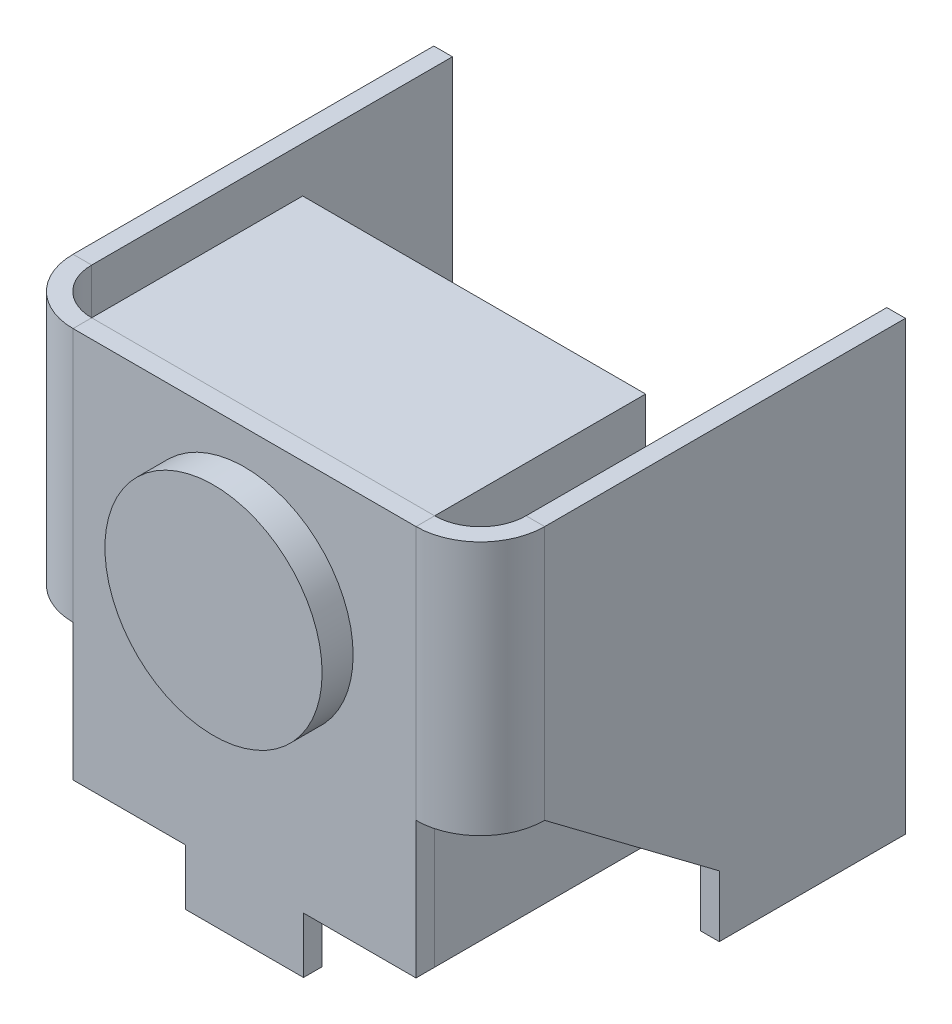
ISO-10303-21;
HEADER;
FILE_DESCRIPTION(('STEP AP214'),'2;1');
FILE_NAME('part.step','',(''),(''),'','','');
FILE_SCHEMA(('AUTOMOTIVE_DESIGN { 1 0 10303 214 1 1 1 1 }'));
ENDSEC;
DATA;
#1=APPLICATION_CONTEXT('core data for automotive mechanical design processes');
#2=APPLICATION_PROTOCOL_DEFINITION('international standard','automotive_design',2000,#1);
#3=PRODUCT_CONTEXT('',#1,'mechanical');
#4=PRODUCT('Part','Part','',(#3));
#5=PRODUCT_RELATED_PRODUCT_CATEGORY('part','',(#4));
#6=PRODUCT_DEFINITION_FORMATION('','',#4);
#7=PRODUCT_DEFINITION_CONTEXT('part definition',#1,'design');
#8=PRODUCT_DEFINITION('design','',#6,#7);
#9=PRODUCT_DEFINITION_SHAPE('','',#8);
#10=(LENGTH_UNIT() NAMED_UNIT(*) SI_UNIT(.MILLI.,.METRE.));
#11=(NAMED_UNIT(*) PLANE_ANGLE_UNIT() SI_UNIT($,.RADIAN.));
#12=(NAMED_UNIT(*) SI_UNIT($,.STERADIAN.) SOLID_ANGLE_UNIT());
#13=UNCERTAINTY_MEASURE_WITH_UNIT(LENGTH_MEASURE(1.E-05),#10,'distance_accuracy_value','');
#14=(GEOMETRIC_REPRESENTATION_CONTEXT(3) GLOBAL_UNCERTAINTY_ASSIGNED_CONTEXT((#13)) GLOBAL_UNIT_ASSIGNED_CONTEXT((#10,
#11,#12)) REPRESENTATION_CONTEXT('',''));
#15=CARTESIAN_POINT('',(0.,0.,0.));
#16=DIRECTION('',(0.,0.,1.));
#17=DIRECTION('',(1.,0.,0.));
#18=AXIS2_PLACEMENT_3D('',#15,#16,#17);
#19=CARTESIAN_POINT('',(2.7634,-2.7,-3.7));
#20=DIRECTION('',(-1.,0.,0.));
#21=DIRECTION('',(0.,0.,1.));
#22=AXIS2_PLACEMENT_3D('',#19,#20,#21);
#23=PLANE('',#22);
#24=DIRECTION('',(0.,-1.,0.));
#25=VECTOR('',#24,1.);
#26=CARTESIAN_POINT('',(2.7634,-2.7,-0.3));
#27=LINE('',#26,#25);
#28=CARTESIAN_POINT('',(2.7634,3.6,-0.3));
#29=VERTEX_POINT('',#28);
#30=CARTESIAN_POINT('',(2.7634,-2.7,-0.3));
#31=VERTEX_POINT('',#30);
#32=EDGE_CURVE('E129',#29,#31,#27,.T.);
#33=ORIENTED_EDGE('',*,*,#32,.T.);
#34=DIRECTION('',(0.,0.,1.));
#35=VECTOR('',#34,1.);
#36=CARTESIAN_POINT('',(2.7634,-2.7,-3.7));
#37=LINE('',#36,#35);
#38=CARTESIAN_POINT('',(2.7634,-2.7,-3.7));
#39=VERTEX_POINT('',#38);
#40=EDGE_CURVE('E14',#39,#31,#37,.T.);
#41=ORIENTED_EDGE('',*,*,#40,.F.);
#42=DIRECTION('',(0.,-1.,0.));
#43=VECTOR('',#42,1.);
#44=CARTESIAN_POINT('',(2.7634,-2.7,-3.7));
#45=LINE('',#44,#43);
#46=CARTESIAN_POINT('',(2.7634,3.6,-3.7));
#47=VERTEX_POINT('',#46);
#48=EDGE_CURVE('E117',#47,#39,#45,.T.);
#49=ORIENTED_EDGE('',*,*,#48,.F.);
#50=DIRECTION('',(0.,0.,1.));
#51=VECTOR('',#50,1.);
#52=CARTESIAN_POINT('',(2.7634,3.6,-3.7));
#53=LINE('',#52,#51);
#54=EDGE_CURVE('E125',#47,#29,#53,.T.);
#55=ORIENTED_EDGE('',*,*,#54,.T.);
#56=EDGE_LOOP('',(#33,#41,#49,#55));
#57=FACE_BOUND('',#56,.T.);
#58=ADVANCED_FACE('F66',(#57),#23,.F.);
#59=CARTESIAN_POINT('',(2.7634,-2.7,-3.7));
#60=DIRECTION('',(0.,1.,0.));
#61=DIRECTION('',(0.,0.,1.));
#62=AXIS2_PLACEMENT_3D('',#59,#60,#61);
#63=PLANE('',#62);
#64=DIRECTION('',(-1.,0.,0.));
#65=VECTOR('',#64,1.);
#66=CARTESIAN_POINT('',(2.7634,-2.7,-0.3));
#67=LINE('',#66,#65);
#68=CARTESIAN_POINT('',(-2.7634,-2.7,-0.3));
#69=VERTEX_POINT('',#68);
#70=EDGE_CURVE('E121',#31,#69,#67,.T.);
#71=ORIENTED_EDGE('',*,*,#70,.T.);
#72=DIRECTION('',(0.,0.,1.));
#73=VECTOR('',#72,1.);
#74=CARTESIAN_POINT('',(-2.7634,-2.7,-3.7));
#75=LINE('',#74,#73);
#76=CARTESIAN_POINT('',(-2.7634,-2.7,-3.7));
#77=VERTEX_POINT('',#76);
#78=EDGE_CURVE('E74',#77,#69,#75,.T.);
#79=ORIENTED_EDGE('',*,*,#78,.F.);
#80=DIRECTION('',(-1.,0.,0.));
#81=VECTOR('',#80,1.);
#82=CARTESIAN_POINT('',(2.7634,-2.7,-3.7));
#83=LINE('',#82,#81);
#84=EDGE_CURVE('E112',#39,#77,#83,.T.);
#85=ORIENTED_EDGE('',*,*,#84,.F.);
#86=ORIENTED_EDGE('',*,*,#40,.T.);
#87=EDGE_LOOP('',(#71,#79,#85,#86));
#88=FACE_BOUND('',#87,.T.);
#89=ADVANCED_FACE('F120',(#88),#63,.F.);
#90=CARTESIAN_POINT('',(-2.7634,-2.7,-3.7));
#91=DIRECTION('',(1.,0.,0.));
#92=DIRECTION('',(0.,0.,-1.));
#93=AXIS2_PLACEMENT_3D('',#90,#91,#92);
#94=PLANE('',#93);
#95=DIRECTION('',(0.,1.,0.));
#96=VECTOR('',#95,1.);
#97=CARTESIAN_POINT('',(-2.7634,-2.7,-0.3));
#98=LINE('',#97,#96);
#99=CARTESIAN_POINT('',(-2.7634,3.6,-0.3));
#100=VERTEX_POINT('',#99);
#101=EDGE_CURVE('E99',#69,#100,#98,.T.);
#102=ORIENTED_EDGE('',*,*,#101,.T.);
#103=DIRECTION('',(0.,0.,1.));
#104=VECTOR('',#103,1.);
#105=CARTESIAN_POINT('',(-2.7634,3.6,-3.7));
#106=LINE('',#105,#104);
#107=CARTESIAN_POINT('',(-2.7634,3.6,-3.7));
#108=VERTEX_POINT('',#107);
#109=EDGE_CURVE('E122',#108,#100,#106,.T.);
#110=ORIENTED_EDGE('',*,*,#109,.F.);
#111=DIRECTION('',(0.,1.,0.));
#112=VECTOR('',#111,1.);
#113=CARTESIAN_POINT('',(-2.7634,-2.7,-3.7));
#114=LINE('',#113,#112);
#115=EDGE_CURVE('E115',#77,#108,#114,.T.);
#116=ORIENTED_EDGE('',*,*,#115,.F.);
#117=ORIENTED_EDGE('',*,*,#78,.T.);
#118=EDGE_LOOP('',(#102,#110,#116,#117));
#119=FACE_BOUND('',#118,.T.);
#120=ADVANCED_FACE('F123',(#119),#94,.F.);
#121=CARTESIAN_POINT('',(2.7634,3.6,-3.7));
#122=DIRECTION('',(0.,-1.,0.));
#123=DIRECTION('',(0.,0.,-1.));
#124=AXIS2_PLACEMENT_3D('',#121,#122,#123);
#125=PLANE('',#124);
#126=DIRECTION('',(1.,0.,0.));
#127=VECTOR('',#126,1.);
#128=CARTESIAN_POINT('',(2.7634,3.6,-0.3));
#129=LINE('',#128,#127);
#130=EDGE_CURVE('E105',#100,#29,#129,.T.);
#131=ORIENTED_EDGE('',*,*,#130,.T.);
#132=ORIENTED_EDGE('',*,*,#54,.F.);
#133=DIRECTION('',(1.,0.,0.));
#134=VECTOR('',#133,1.);
#135=CARTESIAN_POINT('',(2.7634,3.6,-3.7));
#136=LINE('',#135,#134);
#137=EDGE_CURVE('E82',#108,#47,#136,.T.);
#138=ORIENTED_EDGE('',*,*,#137,.F.);
#139=ORIENTED_EDGE('',*,*,#109,.T.);
#140=EDGE_LOOP('',(#131,#132,#138,#139));
#141=FACE_BOUND('',#140,.T.);
#142=ADVANCED_FACE('F137',(#141),#125,.F.);
#143=CARTESIAN_POINT('',(0.,0.,-3.7));
#144=DIRECTION('',(0.,0.,1.));
#145=DIRECTION('',(1.,0.,0.));
#146=AXIS2_PLACEMENT_3D('',#143,#144,#145);
#147=PLANE('',#146);
#148=ORIENTED_EDGE('',*,*,#48,.T.);
#149=ORIENTED_EDGE('',*,*,#84,.T.);
#150=ORIENTED_EDGE('',*,*,#115,.T.);
#151=ORIENTED_EDGE('',*,*,#137,.T.);
#152=EDGE_LOOP('',(#148,#149,#150,#151));
#153=FACE_BOUND('',#152,.T.);
#154=ADVANCED_FACE('F113',(#153),#147,.F.);
#155=CARTESIAN_POINT('',(0.,0.,-0.3));
#156=DIRECTION('',(0.,0.,1.));
#157=DIRECTION('',(1.,0.,0.));
#158=AXIS2_PLACEMENT_3D('',#155,#156,#157);
#159=PLANE('',#158);
#160=CARTESIAN_POINT('',(-2.8421709430404E-11,1.3,-0.3));
#161=DIRECTION('',(0.,0.,1.));
#162=DIRECTION('',(1.,0.,0.));
#163=AXIS2_PLACEMENT_3D('',#160,#161,#162);
#164=CIRCLE('',#163,1.75);
#165=CARTESIAN_POINT('',(1.74999999997158,1.3,-0.3));
#166=VERTEX_POINT('',#165);
#167=EDGE_CURVE('E143',#166,#166,#164,.T.);
#168=ORIENTED_EDGE('',*,*,#167,.F.);
#169=EDGE_LOOP('',(#168));
#170=FACE_BOUND('',#169,.T.);
#171=ORIENTED_EDGE('',*,*,#32,.F.);
#172=ORIENTED_EDGE('',*,*,#130,.F.);
#173=ORIENTED_EDGE('',*,*,#101,.F.);
#174=ORIENTED_EDGE('',*,*,#70,.F.);
#175=EDGE_LOOP('',(#171,#172,#173,#174));
#176=FACE_BOUND('',#175,.T.);
#177=ADVANCED_FACE('F140',(#170,#176),#159,.T.);
#178=CARTESIAN_POINT('',(-2.8421709430404E-11,1.3,0.5));
#179=DIRECTION('',(0.,0.,-1.));
#180=DIRECTION('',(-1.,0.,0.));
#181=AXIS2_PLACEMENT_3D('',#178,#179,#180);
#182=CYLINDRICAL_SURFACE('',#181,1.75);
#183=CARTESIAN_POINT('',(-2.8421709430404E-11,1.3,0.5));
#184=DIRECTION('',(0.,0.,1.));
#185=DIRECTION('',(1.,0.,0.));
#186=AXIS2_PLACEMENT_3D('',#183,#184,#185);
#187=CIRCLE('',#186,1.75);
#188=CARTESIAN_POINT('',(1.74999999997158,1.3,0.5));
#189=VERTEX_POINT('',#188);
#190=EDGE_CURVE('E132',#189,#189,#187,.T.);
#191=ORIENTED_EDGE('',*,*,#190,.F.);
#192=EDGE_LOOP('',(#191));
#193=FACE_BOUND('',#192,.T.);
#194=ORIENTED_EDGE('',*,*,#167,.T.);
#195=EDGE_LOOP('',(#194));
#196=FACE_BOUND('',#195,.T.);
#197=ADVANCED_FACE('F151',(#193,#196),#182,.T.);
#198=CARTESIAN_POINT('',(-2.8421709430404E-11,1.3,0.5));
#199=DIRECTION('',(0.,0.,1.));
#200=DIRECTION('',(1.,0.,0.));
#201=AXIS2_PLACEMENT_3D('',#198,#199,#200);
#202=PLANE('',#201);
#203=ORIENTED_EDGE('',*,*,#190,.T.);
#204=EDGE_LOOP('',(#203));
#205=FACE_BOUND('',#204,.T.);
#206=ADVANCED_FACE('F149',(#205),#202,.T.);
#207=CLOSED_SHELL('',(#58,#89,#120,#142,#154,#177,#197,#206));
#208=MANIFOLD_SOLID_BREP('B2',#207);
#209=CARTESIAN_POINT('',(0.,3.6,-0.3));
#210=DIRECTION('',(0.,1.,0.));
#211=DIRECTION('',(-1.,0.,0.));
#212=AXIS2_PLACEMENT_3D('',#209,#210,#211);
#213=PLANE('',#212);
#214=DIRECTION('',(-1.,0.,0.));
#215=VECTOR('',#214,1.);
#216=CARTESIAN_POINT('',(0.,3.6,-0.3));
#217=LINE('',#216,#215);
#218=CARTESIAN_POINT('',(2.7634,3.6,-0.3));
#219=VERTEX_POINT('',#218);
#220=CARTESIAN_POINT('',(-2.7634,3.6,-0.3));
#221=VERTEX_POINT('',#220);
#222=EDGE_CURVE('E563',#219,#221,#217,.T.);
#223=ORIENTED_EDGE('',*,*,#222,.T.);
#224=DIRECTION('',(0.,0.,1.));
#225=VECTOR('',#224,1.);
#226=CARTESIAN_POINT('',(-2.7634,3.6,-0.3));
#227=LINE('',#226,#225);
#228=CARTESIAN_POINT('',(-2.7634,3.6,0.));
#229=VERTEX_POINT('',#228);
#230=EDGE_CURVE('E550',#221,#229,#227,.T.);
#231=ORIENTED_EDGE('',*,*,#230,.T.);
#232=DIRECTION('',(-1.,0.,0.));
#233=VECTOR('',#232,1.);
#234=CARTESIAN_POINT('',(0.,3.6,0.));
#235=LINE('',#234,#233);
#236=CARTESIAN_POINT('',(2.7634,3.6,0.));
#237=VERTEX_POINT('',#236);
#238=EDGE_CURVE('E564',#237,#229,#235,.T.);
#239=ORIENTED_EDGE('',*,*,#238,.F.);
#240=DIRECTION('',(0.,0.,1.));
#241=VECTOR('',#240,1.);
#242=CARTESIAN_POINT('',(2.7634,3.6,-0.3));
#243=LINE('',#242,#241);
#244=EDGE_CURVE('E397',#219,#237,#243,.T.);
#245=ORIENTED_EDGE('',*,*,#244,.F.);
#246=EDGE_LOOP('',(#223,#231,#239,#245));
#247=FACE_BOUND('',#246,.T.);
#248=ADVANCED_FACE('F219',(#247),#213,.T.);
#249=CARTESIAN_POINT('',(0.,0.,-0.3));
#250=DIRECTION('',(0.,0.,1.));
#251=DIRECTION('',(1.,0.,0.));
#252=AXIS2_PLACEMENT_3D('',#249,#250,#251);
#253=PLANE('',#252);
#254=DIRECTION('',(0.,1.,0.));
#255=VECTOR('',#254,1.);
#256=CARTESIAN_POINT('',(-0.949999999999999,-3.6,-0.3));
#257=LINE('',#256,#255);
#258=CARTESIAN_POINT('',(-0.949999999999999,-3.6,-0.3));
#259=VERTEX_POINT('',#258);
#260=CARTESIAN_POINT('',(-0.949999999999999,-2.7,-0.3));
#261=VERTEX_POINT('',#260);
#262=EDGE_CURVE('E502',#259,#261,#257,.T.);
#263=ORIENTED_EDGE('',*,*,#262,.T.);
#264=DIRECTION('',(-1.,0.,0.));
#265=VECTOR('',#264,1.);
#266=CARTESIAN_POINT('',(-2.7634,-2.7,-0.3));
#267=LINE('',#266,#265);
#268=CARTESIAN_POINT('',(-2.7634,-2.7,-0.3));
#269=VERTEX_POINT('',#268);
#270=EDGE_CURVE('E505',#261,#269,#267,.T.);
#271=ORIENTED_EDGE('',*,*,#270,.T.);
#272=DIRECTION('',(0.,1.,0.));
#273=VECTOR('',#272,1.);
#274=CARTESIAN_POINT('',(-2.7634,3.6,-0.3));
#275=LINE('',#274,#273);
#276=CARTESIAN_POINT('',(-2.7634,-0.5,-0.300000000000001));
#277=VERTEX_POINT('',#276);
#278=EDGE_CURVE('E491',#269,#277,#275,.T.);
#279=ORIENTED_EDGE('',*,*,#278,.T.);
#280=DIRECTION('',(0.,1.,0.));
#281=VECTOR('',#280,1.);
#282=CARTESIAN_POINT('',(-2.7634,3.6,-0.3));
#283=LINE('',#282,#281);
#284=EDGE_CURVE('E553',#221,#277,#283,.F.);
#285=ORIENTED_EDGE('',*,*,#284,.F.);
#286=ORIENTED_EDGE('',*,*,#222,.F.);
#287=DIRECTION('',(0.,1.,0.));
#288=VECTOR('',#287,1.);
#289=CARTESIAN_POINT('',(2.7634,3.6,-0.3));
#290=LINE('',#289,#288);
#291=CARTESIAN_POINT('',(2.7634,-0.5,-0.300000000000001));
#292=VERTEX_POINT('',#291);
#293=EDGE_CURVE('E465',#219,#292,#290,.F.);
#294=ORIENTED_EDGE('',*,*,#293,.T.);
#295=DIRECTION('',(0.,1.,0.));
#296=VECTOR('',#295,1.);
#297=CARTESIAN_POINT('',(2.7634,3.6,-0.3));
#298=LINE('',#297,#296);
#299=CARTESIAN_POINT('',(2.7634,-2.7,-0.3));
#300=VERTEX_POINT('',#299);
#301=EDGE_CURVE('E371',#300,#292,#298,.T.);
#302=ORIENTED_EDGE('',*,*,#301,.F.);
#303=DIRECTION('',(1.,0.,0.));
#304=VECTOR('',#303,1.);
#305=CARTESIAN_POINT('',(2.7634,-2.7,-0.3));
#306=LINE('',#305,#304);
#307=CARTESIAN_POINT('',(0.95,-2.7,-0.3));
#308=VERTEX_POINT('',#307);
#309=EDGE_CURVE('E420',#308,#300,#306,.T.);
#310=ORIENTED_EDGE('',*,*,#309,.F.);
#311=DIRECTION('',(0.,1.,0.));
#312=VECTOR('',#311,1.);
#313=CARTESIAN_POINT('',(0.95,-3.6,-0.3));
#314=LINE('',#313,#312);
#315=CARTESIAN_POINT('',(0.95,-3.6,-0.3));
#316=VERTEX_POINT('',#315);
#317=EDGE_CURVE('E417',#316,#308,#314,.T.);
#318=ORIENTED_EDGE('',*,*,#317,.F.);
#319=DIRECTION('',(1.,0.,0.));
#320=VECTOR('',#319,1.);
#321=CARTESIAN_POINT('',(0.,-3.6,-0.3));
#322=LINE('',#321,#320);
#323=EDGE_CURVE('E561',#259,#316,#322,.T.);
#324=ORIENTED_EDGE('',*,*,#323,.F.);
#325=EDGE_LOOP('',(#263,#271,#279,#285,#286,#294,#302,#310,#318,#324));
#326=FACE_BOUND('',#325,.T.);
#327=ADVANCED_FACE('F633',(#326),#253,.F.);
#328=CARTESIAN_POINT('',(0.,0.,0.));
#329=DIRECTION('',(0.,0.,1.));
#330=DIRECTION('',(1.,0.,0.));
#331=AXIS2_PLACEMENT_3D('',#328,#329,#330);
#332=PLANE('',#331);
#333=DIRECTION('',(-1.,0.,0.));
#334=VECTOR('',#333,1.);
#335=CARTESIAN_POINT('',(-2.7634,-2.7,0.));
#336=LINE('',#335,#334);
#337=CARTESIAN_POINT('',(-0.949999999999999,-2.7,0.));
#338=VERTEX_POINT('',#337);
#339=CARTESIAN_POINT('',(-2.7634,-2.7,0.));
#340=VERTEX_POINT('',#339);
#341=EDGE_CURVE('E506',#338,#340,#336,.T.);
#342=ORIENTED_EDGE('',*,*,#341,.F.);
#343=DIRECTION('',(0.,1.,0.));
#344=VECTOR('',#343,1.);
#345=CARTESIAN_POINT('',(-0.949999999999999,-3.6,0.));
#346=LINE('',#345,#344);
#347=CARTESIAN_POINT('',(-0.949999999999999,-3.6,0.));
#348=VERTEX_POINT('',#347);
#349=EDGE_CURVE('E501',#348,#338,#346,.T.);
#350=ORIENTED_EDGE('',*,*,#349,.F.);
#351=DIRECTION('',(1.,0.,0.));
#352=VECTOR('',#351,1.);
#353=CARTESIAN_POINT('',(0.,-3.6,0.));
#354=LINE('',#353,#352);
#355=CARTESIAN_POINT('',(0.95,-3.6,0.));
#356=VERTEX_POINT('',#355);
#357=EDGE_CURVE('E560',#348,#356,#354,.T.);
#358=ORIENTED_EDGE('',*,*,#357,.T.);
#359=DIRECTION('',(0.,1.,0.));
#360=VECTOR('',#359,1.);
#361=CARTESIAN_POINT('',(0.95,-3.6,0.));
#362=LINE('',#361,#360);
#363=CARTESIAN_POINT('',(0.95,-2.7,0.));
#364=VERTEX_POINT('',#363);
#365=EDGE_CURVE('E386',#356,#364,#362,.T.);
#366=ORIENTED_EDGE('',*,*,#365,.T.);
#367=DIRECTION('',(1.,0.,0.));
#368=VECTOR('',#367,1.);
#369=CARTESIAN_POINT('',(2.7634,-2.7,0.));
#370=LINE('',#369,#368);
#371=CARTESIAN_POINT('',(2.7634,-2.7,0.));
#372=VERTEX_POINT('',#371);
#373=EDGE_CURVE('E403',#364,#372,#370,.T.);
#374=ORIENTED_EDGE('',*,*,#373,.T.);
#375=DIRECTION('',(0.,1.,0.));
#376=VECTOR('',#375,1.);
#377=CARTESIAN_POINT('',(2.7634,-0.5,0.));
#378=LINE('',#377,#376);
#379=CARTESIAN_POINT('',(2.7634,-0.5,0.));
#380=VERTEX_POINT('',#379);
#381=EDGE_CURVE('E368',#372,#380,#378,.T.);
#382=ORIENTED_EDGE('',*,*,#381,.T.);
#383=DIRECTION('',(0.,1.,0.));
#384=VECTOR('',#383,1.);
#385=CARTESIAN_POINT('',(2.7634,3.6,0.));
#386=LINE('',#385,#384);
#387=EDGE_CURVE('E390',#237,#380,#386,.F.);
#388=ORIENTED_EDGE('',*,*,#387,.F.);
#389=ORIENTED_EDGE('',*,*,#238,.T.);
#390=DIRECTION('',(0.,1.,0.));
#391=VECTOR('',#390,1.);
#392=CARTESIAN_POINT('',(-2.7634,3.6,0.));
#393=LINE('',#392,#391);
#394=CARTESIAN_POINT('',(-2.7634,-0.5,0.));
#395=VERTEX_POINT('',#394);
#396=EDGE_CURVE('E236',#229,#395,#393,.F.);
#397=ORIENTED_EDGE('',*,*,#396,.T.);
#398=DIRECTION('',(0.,1.,0.));
#399=VECTOR('',#398,1.);
#400=CARTESIAN_POINT('',(-2.7634,-0.5,0.));
#401=LINE('',#400,#399);
#402=EDGE_CURVE('E479',#340,#395,#401,.T.);
#403=ORIENTED_EDGE('',*,*,#402,.F.);
#404=EDGE_LOOP('',(#342,#350,#358,#366,#374,#382,#388,#389,#397,#403));
#405=FACE_BOUND('',#404,.T.);
#406=ADVANCED_FACE('F400',(#405),#332,.T.);
#407=CARTESIAN_POINT('',(0.,-3.6,-0.3));
#408=DIRECTION('',(0.,-1.,0.));
#409=DIRECTION('',(0.,0.,-1.));
#410=AXIS2_PLACEMENT_3D('',#407,#408,#409);
#411=PLANE('',#410);
#412=DIRECTION('',(0.,0.,1.));
#413=VECTOR('',#412,1.);
#414=CARTESIAN_POINT('',(-0.949999999999999,-3.6,-0.3));
#415=LINE('',#414,#413);
#416=EDGE_CURVE('E509',#259,#348,#415,.T.);
#417=ORIENTED_EDGE('',*,*,#416,.F.);
#418=ORIENTED_EDGE('',*,*,#323,.T.);
#419=DIRECTION('',(0.,0.,1.));
#420=VECTOR('',#419,1.);
#421=CARTESIAN_POINT('',(0.95,-3.6,-0.3));
#422=LINE('',#421,#420);
#423=EDGE_CURVE('E423',#316,#356,#422,.T.);
#424=ORIENTED_EDGE('',*,*,#423,.T.);
#425=ORIENTED_EDGE('',*,*,#357,.F.);
#426=EDGE_LOOP('',(#417,#418,#424,#425));
#427=FACE_BOUND('',#426,.T.);
#428=ADVANCED_FACE('F221',(#427),#411,.T.);
#429=CARTESIAN_POINT('',(-2.7634,3.6,-1.0366));
#430=DIRECTION('',(0.,-1.,0.));
#431=DIRECTION('',(0.,0.,-1.));
#432=AXIS2_PLACEMENT_3D('',#429,#430,#431);
#433=PLANE('',#432);
#434=CARTESIAN_POINT('',(-2.7634,3.6,-1.0366));
#435=DIRECTION('',(0.,1.,0.));
#436=DIRECTION('',(0.,0.,1.));
#437=AXIS2_PLACEMENT_3D('',#434,#435,#436);
#438=CIRCLE('',#437,0.736599999999999);
#439=CARTESIAN_POINT('',(-3.5,3.6,-1.0366));
#440=VERTEX_POINT('',#439);
#441=EDGE_CURVE('E523',#440,#221,#438,.T.);
#442=ORIENTED_EDGE('',*,*,#441,.F.);
#443=DIRECTION('',(1.,0.,0.));
#444=VECTOR('',#443,1.);
#445=CARTESIAN_POINT('',(-3.5,3.6,-1.0366));
#446=LINE('',#445,#444);
#447=CARTESIAN_POINT('',(-3.8,3.6,-1.0366));
#448=VERTEX_POINT('',#447);
#449=EDGE_CURVE('E544',#440,#448,#446,.F.);
#450=ORIENTED_EDGE('',*,*,#449,.T.);
#451=CARTESIAN_POINT('',(-2.7634,3.6,-1.0366));
#452=DIRECTION('',(0.,1.,0.));
#453=DIRECTION('',(0.,0.,1.));
#454=AXIS2_PLACEMENT_3D('',#451,#452,#453);
#455=CIRCLE('',#454,1.0366);
#456=EDGE_CURVE('E551',#448,#229,#455,.T.);
#457=ORIENTED_EDGE('',*,*,#456,.T.);
#458=ORIENTED_EDGE('',*,*,#230,.F.);
#459=EDGE_LOOP('',(#442,#450,#457,#458));
#460=FACE_BOUND('',#459,.T.);
#461=ADVANCED_FACE('F592',(#460),#433,.F.);
#462=CARTESIAN_POINT('',(-2.7634,3.6,-1.0366));
#463=DIRECTION('',(0.,1.,0.));
#464=DIRECTION('',(-1.,0.,0.));
#465=AXIS2_PLACEMENT_3D('',#462,#463,#464);
#466=CYLINDRICAL_SURFACE('',#465,1.0366);
#467=CARTESIAN_POINT('',(-2.7634,-0.5,-1.0366));
#468=DIRECTION('',(0.,1.,0.));
#469=DIRECTION('',(0.,0.,1.));
#470=AXIS2_PLACEMENT_3D('',#467,#468,#469);
#471=CIRCLE('',#470,1.0366);
#472=CARTESIAN_POINT('',(-3.8,-0.5,-1.0366));
#473=VERTEX_POINT('',#472);
#474=EDGE_CURVE('E499',#395,#473,#471,.F.);
#475=ORIENTED_EDGE('',*,*,#474,.F.);
#476=ORIENTED_EDGE('',*,*,#396,.F.);
#477=ORIENTED_EDGE('',*,*,#456,.F.);
#478=DIRECTION('',(0.,1.,0.));
#479=VECTOR('',#478,1.);
#480=CARTESIAN_POINT('',(-3.8,-3.6,-1.0366));
#481=LINE('',#480,#479);
#482=EDGE_CURVE('E541',#448,#473,#481,.F.);
#483=ORIENTED_EDGE('',*,*,#482,.T.);
#484=EDGE_LOOP('',(#475,#476,#477,#483));
#485=FACE_BOUND('',#484,.T.);
#486=ADVANCED_FACE('F607',(#485),#466,.T.);
#487=CARTESIAN_POINT('',(-2.7634,3.6,-1.0366));
#488=DIRECTION('',(0.,1.,0.));
#489=DIRECTION('',(-1.,0.,0.));
#490=AXIS2_PLACEMENT_3D('',#487,#488,#489);
#491=CYLINDRICAL_SURFACE('',#490,0.736599999999999);
#492=ORIENTED_EDGE('',*,*,#284,.T.);
#493=CARTESIAN_POINT('',(-2.7634,-0.5,-1.0366));
#494=DIRECTION('',(0.,1.,0.));
#495=DIRECTION('',(0.,0.,1.));
#496=AXIS2_PLACEMENT_3D('',#493,#494,#495);
#497=CIRCLE('',#496,0.736599999999999);
#498=CARTESIAN_POINT('',(-3.50000000000001,-0.5,-1.0366));
#499=VERTEX_POINT('',#498);
#500=EDGE_CURVE('E64',#277,#499,#497,.F.);
#501=ORIENTED_EDGE('',*,*,#500,.T.);
#502=DIRECTION('',(0.,1.,0.));
#503=VECTOR('',#502,1.);
#504=CARTESIAN_POINT('',(-3.5,-3.6,-1.0366));
#505=LINE('',#504,#503);
#506=EDGE_CURVE('E516',#499,#440,#505,.T.);
#507=ORIENTED_EDGE('',*,*,#506,.T.);
#508=ORIENTED_EDGE('',*,*,#441,.T.);
#509=EDGE_LOOP('',(#492,#501,#507,#508));
#510=FACE_BOUND('',#509,.T.);
#511=ADVANCED_FACE('F588',(#510),#491,.F.);
#512=CARTESIAN_POINT('',(-3.80000000000002,3.6,-6.85));
#513=DIRECTION('',(0.,-1.,0.));
#514=DIRECTION('',(1.,0.,0.));
#515=AXIS2_PLACEMENT_3D('',#512,#513,#514);
#516=PLANE('',#515);
#517=ORIENTED_EDGE('',*,*,#449,.F.);
#518=DIRECTION('',(0.,0.,1.));
#519=VECTOR('',#518,1.);
#520=CARTESIAN_POINT('',(-3.50000000000002,3.6,-6.85));
#521=LINE('',#520,#519);
#522=CARTESIAN_POINT('',(-3.50000000000002,3.6,-6.85));
#523=VERTEX_POINT('',#522);
#524=EDGE_CURVE('E539',#440,#523,#521,.F.);
#525=ORIENTED_EDGE('',*,*,#524,.T.);
#526=DIRECTION('',(1.,0.,0.));
#527=VECTOR('',#526,1.);
#528=CARTESIAN_POINT('',(-3.80000000000002,3.6,-6.85));
#529=LINE('',#528,#527);
#530=CARTESIAN_POINT('',(-3.80000000000002,3.6,-6.85));
#531=VERTEX_POINT('',#530);
#532=EDGE_CURVE('E520',#531,#523,#529,.T.);
#533=ORIENTED_EDGE('',*,*,#532,.F.);
#534=DIRECTION('',(0.,0.,-1.));
#535=VECTOR('',#534,1.);
#536=CARTESIAN_POINT('',(-3.8,3.6,0.));
#537=LINE('',#536,#535);
#538=EDGE_CURVE('E532',#448,#531,#537,.T.);
#539=ORIENTED_EDGE('',*,*,#538,.F.);
#540=EDGE_LOOP('',(#517,#525,#533,#539));
#541=FACE_BOUND('',#540,.T.);
#542=ADVANCED_FACE('F596',(#541),#516,.F.);
#543=CARTESIAN_POINT('',(-3.8,-3.6,-0.299999999999999));
#544=DIRECTION('',(0.,1.,0.));
#545=DIRECTION('',(-1.,0.,0.));
#546=AXIS2_PLACEMENT_3D('',#543,#544,#545);
#547=PLANE('',#546);
#548=DIRECTION('',(0.,0.,-1.));
#549=VECTOR('',#548,1.);
#550=CARTESIAN_POINT('',(-3.5,-3.6,-0.3));
#551=LINE('',#550,#549);
#552=CARTESIAN_POINT('',(-3.50000000000002,-3.6,-6.85));
#553=VERTEX_POINT('',#552);
#554=CARTESIAN_POINT('',(-3.50000000000001,-3.6,-3.85));
#555=VERTEX_POINT('',#554);
#556=EDGE_CURVE('E534',#553,#555,#551,.F.);
#557=ORIENTED_EDGE('',*,*,#556,.T.);
#558=DIRECTION('',(-1.,0.,0.));
#559=VECTOR('',#558,1.);
#560=CARTESIAN_POINT('',(-2.76340000000002,-3.6,-3.85));
#561=LINE('',#560,#559);
#562=CARTESIAN_POINT('',(-3.80000000000001,-3.6,-3.85));
#563=VERTEX_POINT('',#562);
#564=EDGE_CURVE('E485',#555,#563,#561,.T.);
#565=ORIENTED_EDGE('',*,*,#564,.T.);
#566=DIRECTION('',(0.,0.,1.));
#567=VECTOR('',#566,1.);
#568=CARTESIAN_POINT('',(-3.8,-3.6,0.));
#569=LINE('',#568,#567);
#570=CARTESIAN_POINT('',(-3.80000000000002,-3.6,-6.85));
#571=VERTEX_POINT('',#570);
#572=EDGE_CURVE('E527',#571,#563,#569,.T.);
#573=ORIENTED_EDGE('',*,*,#572,.F.);
#574=DIRECTION('',(1.,0.,0.));
#575=VECTOR('',#574,1.);
#576=CARTESIAN_POINT('',(-3.80000000000002,-3.6,-6.85));
#577=LINE('',#576,#575);
#578=EDGE_CURVE('E524',#571,#553,#577,.T.);
#579=ORIENTED_EDGE('',*,*,#578,.T.);
#580=EDGE_LOOP('',(#557,#565,#573,#579));
#581=FACE_BOUND('',#580,.T.);
#582=ADVANCED_FACE('F606',(#581),#547,.F.);
#583=CARTESIAN_POINT('',(-3.8,0.,0.));
#584=DIRECTION('',(1.,0.,0.));
#585=DIRECTION('',(0.,0.,-1.));
#586=AXIS2_PLACEMENT_3D('',#583,#584,#585);
#587=PLANE('',#586);
#588=ORIENTED_EDGE('',*,*,#572,.T.);
#589=DIRECTION('',(0.,-1.,0.));
#590=VECTOR('',#589,1.);
#591=CARTESIAN_POINT('',(-3.80000000000001,-3.6,-3.85));
#592=LINE('',#591,#590);
#593=CARTESIAN_POINT('',(-3.80000000000001,-2.61133184429197,-3.85));
#594=VERTEX_POINT('',#593);
#595=EDGE_CURVE('E478',#594,#563,#592,.T.);
#596=ORIENTED_EDGE('',*,*,#595,.F.);
#597=DIRECTION('',(0.,-0.600233201469259,-0.799825045778115));
#598=VECTOR('',#597,1.);
#599=CARTESIAN_POINT('',(-3.80000000000001,-2.61133184429197,-3.85));
#600=LINE('',#599,#598);
#601=EDGE_CURVE('E482',#473,#594,#600,.T.);
#602=ORIENTED_EDGE('',*,*,#601,.F.);
#603=ORIENTED_EDGE('',*,*,#482,.F.);
#604=ORIENTED_EDGE('',*,*,#538,.T.);
#605=DIRECTION('',(0.,-1.,0.));
#606=VECTOR('',#605,1.);
#607=CARTESIAN_POINT('',(-3.80000000000002,0.,-6.85));
#608=LINE('',#607,#606);
#609=EDGE_CURVE('E530',#531,#571,#608,.T.);
#610=ORIENTED_EDGE('',*,*,#609,.T.);
#611=EDGE_LOOP('',(#588,#596,#602,#603,#604,#610));
#612=FACE_BOUND('',#611,.T.);
#613=ADVANCED_FACE('F600',(#612),#587,.F.);
#614=CARTESIAN_POINT('',(-3.5,0.,0.));
#615=DIRECTION('',(1.,0.,0.));
#616=DIRECTION('',(0.,0.,-1.));
#617=AXIS2_PLACEMENT_3D('',#614,#615,#616);
#618=PLANE('',#617);
#619=DIRECTION('',(0.,1.,0.));
#620=VECTOR('',#619,1.);
#621=CARTESIAN_POINT('',(-3.50000000000001,0.,-3.85));
#622=LINE('',#621,#620);
#623=CARTESIAN_POINT('',(-3.50000000000001,-2.61133184429197,-3.85));
#624=VERTEX_POINT('',#623);
#625=EDGE_CURVE('E228',#555,#624,#622,.T.);
#626=ORIENTED_EDGE('',*,*,#625,.F.);
#627=ORIENTED_EDGE('',*,*,#556,.F.);
#628=DIRECTION('',(0.,1.,0.));
#629=VECTOR('',#628,1.);
#630=CARTESIAN_POINT('',(-3.50000000000002,-3.6,-6.85));
#631=LINE('',#630,#629);
#632=EDGE_CURVE('E537',#523,#553,#631,.F.);
#633=ORIENTED_EDGE('',*,*,#632,.F.);
#634=ORIENTED_EDGE('',*,*,#524,.F.);
#635=ORIENTED_EDGE('',*,*,#506,.F.);
#636=DIRECTION('',(0.,0.600233201469259,0.799825045778116));
#637=VECTOR('',#636,1.);
#638=CARTESIAN_POINT('',(-3.5,0.17779248056676,-0.133425366423624));
#639=LINE('',#638,#637);
#640=EDGE_CURVE('E567',#624,#499,#639,.T.);
#641=ORIENTED_EDGE('',*,*,#640,.F.);
#642=EDGE_LOOP('',(#626,#627,#633,#634,#635,#641));
#643=FACE_BOUND('',#642,.T.);
#644=ADVANCED_FACE('F583',(#643),#618,.T.);
#645=CARTESIAN_POINT('',(-3.80000000000002,-3.6,-6.85));
#646=DIRECTION('',(0.,0.,1.));
#647=DIRECTION('',(1.,0.,0.));
#648=AXIS2_PLACEMENT_3D('',#645,#646,#647);
#649=PLANE('',#648);
#650=ORIENTED_EDGE('',*,*,#632,.T.);
#651=ORIENTED_EDGE('',*,*,#578,.F.);
#652=ORIENTED_EDGE('',*,*,#609,.F.);
#653=ORIENTED_EDGE('',*,*,#532,.T.);
#654=EDGE_LOOP('',(#650,#651,#652,#653));
#655=FACE_BOUND('',#654,.T.);
#656=ADVANCED_FACE('F603',(#655),#649,.F.);
#657=CARTESIAN_POINT('',(-2.7634,-2.7,-0.3));
#658=DIRECTION('',(0.,1.,0.));
#659=DIRECTION('',(0.,0.,1.));
#660=AXIS2_PLACEMENT_3D('',#657,#658,#659);
#661=PLANE('',#660);
#662=ORIENTED_EDGE('',*,*,#341,.T.);
#663=DIRECTION('',(0.,0.,1.));
#664=VECTOR('',#663,1.);
#665=CARTESIAN_POINT('',(-2.7634,-2.7,-0.3));
#666=LINE('',#665,#664);
#667=EDGE_CURVE('E514',#269,#340,#666,.T.);
#668=ORIENTED_EDGE('',*,*,#667,.F.);
#669=ORIENTED_EDGE('',*,*,#270,.F.);
#670=DIRECTION('',(0.,0.,1.));
#671=VECTOR('',#670,1.);
#672=CARTESIAN_POINT('',(-0.949999999999999,-2.7,-0.3));
#673=LINE('',#672,#671);
#674=EDGE_CURVE('E517',#261,#338,#673,.T.);
#675=ORIENTED_EDGE('',*,*,#674,.T.);
#676=EDGE_LOOP('',(#662,#668,#669,#675));
#677=FACE_BOUND('',#676,.T.);
#678=ADVANCED_FACE('F616',(#677),#661,.F.);
#679=CARTESIAN_POINT('',(-0.949999999999999,-3.6,-0.3));
#680=DIRECTION('',(1.,0.,0.));
#681=DIRECTION('',(0.,1.,0.));
#682=AXIS2_PLACEMENT_3D('',#679,#680,#681);
#683=PLANE('',#682);
#684=ORIENTED_EDGE('',*,*,#349,.T.);
#685=ORIENTED_EDGE('',*,*,#674,.F.);
#686=ORIENTED_EDGE('',*,*,#262,.F.);
#687=ORIENTED_EDGE('',*,*,#416,.T.);
#688=EDGE_LOOP('',(#684,#685,#686,#687));
#689=FACE_BOUND('',#688,.T.);
#690=ADVANCED_FACE('F619',(#689),#683,.F.);
#691=CARTESIAN_POINT('',(-2.76340000000001,-0.5,-1.0366));
#692=DIRECTION('',(0.,1.,0.));
#693=DIRECTION('',(0.,0.,1.));
#694=AXIS2_PLACEMENT_3D('',#691,#692,#693);
#695=PLANE('',#694);
#696=ORIENTED_EDGE('',*,*,#474,.T.);
#697=DIRECTION('',(-1.,0.,0.));
#698=VECTOR('',#697,1.);
#699=CARTESIAN_POINT('',(-2.76340000000001,-0.5,-1.0366));
#700=LINE('',#699,#698);
#701=EDGE_CURVE('E492',#499,#473,#700,.T.);
#702=ORIENTED_EDGE('',*,*,#701,.F.);
#703=ORIENTED_EDGE('',*,*,#500,.F.);
#704=DIRECTION('',(0.,0.,-1.));
#705=VECTOR('',#704,1.);
#706=CARTESIAN_POINT('',(-2.76340000000001,-0.5,-1.0366));
#707=LINE('',#706,#705);
#708=EDGE_CURVE('E481',#395,#277,#707,.T.);
#709=ORIENTED_EDGE('',*,*,#708,.F.);
#710=EDGE_LOOP('',(#696,#702,#703,#709));
#711=FACE_BOUND('',#710,.T.);
#712=ADVANCED_FACE('F699',(#711),#695,.F.);
#713=CARTESIAN_POINT('',(-2.7634,0.,0.));
#714=DIRECTION('',(1.,0.,0.));
#715=DIRECTION('',(0.,0.,-1.));
#716=AXIS2_PLACEMENT_3D('',#713,#714,#715);
#717=PLANE('',#716);
#718=ORIENTED_EDGE('',*,*,#667,.T.);
#719=ORIENTED_EDGE('',*,*,#402,.T.);
#720=ORIENTED_EDGE('',*,*,#708,.T.);
#721=ORIENTED_EDGE('',*,*,#278,.F.);
#722=EDGE_LOOP('',(#718,#719,#720,#721));
#723=FACE_BOUND('',#722,.T.);
#724=ADVANCED_FACE('F704',(#723),#717,.F.);
#725=CARTESIAN_POINT('',(-2.76340000000002,-3.6,-3.85));
#726=DIRECTION('',(0.,0.,-1.));
#727=DIRECTION('',(-1.,0.,0.));
#728=AXIS2_PLACEMENT_3D('',#725,#726,#727);
#729=PLANE('',#728);
#730=ORIENTED_EDGE('',*,*,#625,.T.);
#731=DIRECTION('',(-1.,0.,0.));
#732=VECTOR('',#731,1.);
#733=CARTESIAN_POINT('',(-2.76340000000002,-2.61133184429197,-3.85));
#734=LINE('',#733,#732);
#735=EDGE_CURVE('E489',#624,#594,#734,.T.);
#736=ORIENTED_EDGE('',*,*,#735,.T.);
#737=ORIENTED_EDGE('',*,*,#595,.T.);
#738=ORIENTED_EDGE('',*,*,#564,.F.);
#739=EDGE_LOOP('',(#730,#736,#737,#738));
#740=FACE_BOUND('',#739,.T.);
#741=ADVANCED_FACE('F573',(#740),#729,.F.);
#742=CARTESIAN_POINT('',(-2.76340000000002,-2.61133184429197,-3.85));
#743=DIRECTION('',(0.,0.799825045778115,-0.600233201469259));
#744=DIRECTION('',(0.,0.600233201469259,0.799825045778116));
#745=AXIS2_PLACEMENT_3D('',#742,#743,#744);
#746=PLANE('',#745);
#747=ORIENTED_EDGE('',*,*,#640,.T.);
#748=ORIENTED_EDGE('',*,*,#701,.T.);
#749=ORIENTED_EDGE('',*,*,#601,.T.);
#750=ORIENTED_EDGE('',*,*,#735,.F.);
#751=EDGE_LOOP('',(#747,#748,#749,#750));
#752=FACE_BOUND('',#751,.T.);
#753=ADVANCED_FACE('F578',(#752),#746,.F.);
#754=CARTESIAN_POINT('',(2.7634,3.6,-1.0366));
#755=DIRECTION('',(0.,-1.,0.));
#756=DIRECTION('',(0.,0.,-1.));
#757=AXIS2_PLACEMENT_3D('',#754,#755,#756);
#758=PLANE('',#757);
#759=CARTESIAN_POINT('',(2.7634,3.6,-1.0366));
#760=DIRECTION('',(0.,-1.,0.));
#761=DIRECTION('',(0.,0.,1.));
#762=AXIS2_PLACEMENT_3D('',#759,#760,#761);
#763=CIRCLE('',#762,0.736599999999999);
#764=CARTESIAN_POINT('',(3.5,3.6,-1.0366));
#765=VERTEX_POINT('',#764);
#766=EDGE_CURVE('E436',#765,#219,#763,.T.);
#767=ORIENTED_EDGE('',*,*,#766,.T.);
#768=ORIENTED_EDGE('',*,*,#244,.T.);
#769=CARTESIAN_POINT('',(2.7634,3.6,-1.0366));
#770=DIRECTION('',(0.,-1.,0.));
#771=DIRECTION('',(0.,0.,1.));
#772=AXIS2_PLACEMENT_3D('',#769,#770,#771);
#773=CIRCLE('',#772,1.0366);
#774=CARTESIAN_POINT('',(3.8,3.6,-1.0366));
#775=VERTEX_POINT('',#774);
#776=EDGE_CURVE('E393',#775,#237,#773,.T.);
#777=ORIENTED_EDGE('',*,*,#776,.F.);
#778=DIRECTION('',(-1.,0.,0.));
#779=VECTOR('',#778,1.);
#780=CARTESIAN_POINT('',(3.5,3.6,-1.0366));
#781=LINE('',#780,#779);
#782=EDGE_CURVE('E459',#765,#775,#781,.F.);
#783=ORIENTED_EDGE('',*,*,#782,.F.);
#784=EDGE_LOOP('',(#767,#768,#777,#783));
#785=FACE_BOUND('',#784,.T.);
#786=ADVANCED_FACE('F640',(#785),#758,.F.);
#787=CARTESIAN_POINT('',(2.7634,3.6,-1.0366));
#788=DIRECTION('',(0.,1.,0.));
#789=DIRECTION('',(1.,0.,0.));
#790=AXIS2_PLACEMENT_3D('',#787,#788,#789);
#791=CYLINDRICAL_SURFACE('',#790,1.0366);
#792=CARTESIAN_POINT('',(2.7634,-0.5,-1.0366));
#793=DIRECTION('',(0.,-1.,0.));
#794=DIRECTION('',(0.,0.,1.));
#795=AXIS2_PLACEMENT_3D('',#792,#793,#794);
#796=CIRCLE('',#795,1.0366);
#797=CARTESIAN_POINT('',(3.8,-0.5,-1.0366));
#798=VERTEX_POINT('',#797);
#799=EDGE_CURVE('E379',#380,#798,#796,.F.);
#800=ORIENTED_EDGE('',*,*,#799,.T.);
#801=DIRECTION('',(0.,1.,0.));
#802=VECTOR('',#801,1.);
#803=CARTESIAN_POINT('',(3.8,-3.6,-1.0366));
#804=LINE('',#803,#802);
#805=EDGE_CURVE('E456',#775,#798,#804,.F.);
#806=ORIENTED_EDGE('',*,*,#805,.F.);
#807=ORIENTED_EDGE('',*,*,#776,.T.);
#808=ORIENTED_EDGE('',*,*,#387,.T.);
#809=EDGE_LOOP('',(#800,#806,#807,#808));
#810=FACE_BOUND('',#809,.T.);
#811=ADVANCED_FACE('F391',(#810),#791,.T.);
#812=CARTESIAN_POINT('',(2.7634,3.6,-1.0366));
#813=DIRECTION('',(0.,1.,0.));
#814=DIRECTION('',(1.,0.,0.));
#815=AXIS2_PLACEMENT_3D('',#812,#813,#814);
#816=CYLINDRICAL_SURFACE('',#815,0.736599999999999);
#817=ORIENTED_EDGE('',*,*,#293,.F.);
#818=ORIENTED_EDGE('',*,*,#766,.F.);
#819=DIRECTION('',(0.,1.,0.));
#820=VECTOR('',#819,1.);
#821=CARTESIAN_POINT('',(3.5,-3.6,-1.0366));
#822=LINE('',#821,#820);
#823=CARTESIAN_POINT('',(3.50000000000001,-0.5,-1.0366));
#824=VERTEX_POINT('',#823);
#825=EDGE_CURVE('E428',#824,#765,#822,.T.);
#826=ORIENTED_EDGE('',*,*,#825,.F.);
#827=CARTESIAN_POINT('',(2.7634,-0.5,-1.0366));
#828=DIRECTION('',(0.,-1.,0.));
#829=DIRECTION('',(0.,0.,1.));
#830=AXIS2_PLACEMENT_3D('',#827,#828,#829);
#831=CIRCLE('',#830,0.736599999999999);
#832=EDGE_CURVE('E476',#292,#824,#831,.F.);
#833=ORIENTED_EDGE('',*,*,#832,.F.);
#834=EDGE_LOOP('',(#817,#818,#826,#833));
#835=FACE_BOUND('',#834,.T.);
#836=ADVANCED_FACE('F637',(#835),#816,.F.);
#837=CARTESIAN_POINT('',(3.80000000000002,3.6,-6.85));
#838=DIRECTION('',(0.,-1.,0.));
#839=DIRECTION('',(-1.,0.,0.));
#840=AXIS2_PLACEMENT_3D('',#837,#838,#839);
#841=PLANE('',#840);
#842=ORIENTED_EDGE('',*,*,#782,.T.);
#843=DIRECTION('',(0.,0.,-1.));
#844=VECTOR('',#843,1.);
#845=CARTESIAN_POINT('',(3.8,3.6,0.));
#846=LINE('',#845,#844);
#847=CARTESIAN_POINT('',(3.80000000000002,3.6,-6.85));
#848=VERTEX_POINT('',#847);
#849=EDGE_CURVE('E445',#775,#848,#846,.T.);
#850=ORIENTED_EDGE('',*,*,#849,.T.);
#851=DIRECTION('',(-1.,0.,0.));
#852=VECTOR('',#851,1.);
#853=CARTESIAN_POINT('',(3.80000000000002,3.6,-6.85));
#854=LINE('',#853,#852);
#855=CARTESIAN_POINT('',(3.50000000000002,3.6,-6.85));
#856=VERTEX_POINT('',#855);
#857=EDGE_CURVE('E433',#848,#856,#854,.T.);
#858=ORIENTED_EDGE('',*,*,#857,.T.);
#859=DIRECTION('',(0.,0.,1.));
#860=VECTOR('',#859,1.);
#861=CARTESIAN_POINT('',(3.50000000000002,3.6,-6.85));
#862=LINE('',#861,#860);
#863=EDGE_CURVE('E453',#765,#856,#862,.F.);
#864=ORIENTED_EDGE('',*,*,#863,.F.);
#865=EDGE_LOOP('',(#842,#850,#858,#864));
#866=FACE_BOUND('',#865,.T.);
#867=ADVANCED_FACE('F643',(#866),#841,.F.);
#868=CARTESIAN_POINT('',(3.8,-3.6,-0.299999999999999));
#869=DIRECTION('',(0.,1.,0.));
#870=DIRECTION('',(1.,0.,0.));
#871=AXIS2_PLACEMENT_3D('',#868,#869,#870);
#872=PLANE('',#871);
#873=DIRECTION('',(0.,0.,-1.));
#874=VECTOR('',#873,1.);
#875=CARTESIAN_POINT('',(3.5,-3.6,-0.3));
#876=LINE('',#875,#874);
#877=CARTESIAN_POINT('',(3.50000000000002,-3.6,-6.85));
#878=VERTEX_POINT('',#877);
#879=CARTESIAN_POINT('',(3.50000000000001,-3.6,-3.85));
#880=VERTEX_POINT('',#879);
#881=EDGE_CURVE('E448',#878,#880,#876,.F.);
#882=ORIENTED_EDGE('',*,*,#881,.F.);
#883=DIRECTION('',(-1.,0.,0.));
#884=VECTOR('',#883,1.);
#885=CARTESIAN_POINT('',(3.80000000000002,-3.6,-6.85));
#886=LINE('',#885,#884);
#887=CARTESIAN_POINT('',(3.80000000000002,-3.6,-6.85));
#888=VERTEX_POINT('',#887);
#889=EDGE_CURVE('E437',#888,#878,#886,.T.);
#890=ORIENTED_EDGE('',*,*,#889,.F.);
#891=DIRECTION('',(0.,0.,1.));
#892=VECTOR('',#891,1.);
#893=CARTESIAN_POINT('',(3.8,-3.6,0.));
#894=LINE('',#893,#892);
#895=CARTESIAN_POINT('',(3.80000000000001,-3.6,-3.85));
#896=VERTEX_POINT('',#895);
#897=EDGE_CURVE('E440',#888,#896,#894,.T.);
#898=ORIENTED_EDGE('',*,*,#897,.T.);
#899=DIRECTION('',(1.,0.,0.));
#900=VECTOR('',#899,1.);
#901=CARTESIAN_POINT('',(2.76340000000002,-3.6,-3.85));
#902=LINE('',#901,#900);
#903=EDGE_CURVE('E376',#880,#896,#902,.T.);
#904=ORIENTED_EDGE('',*,*,#903,.F.);
#905=EDGE_LOOP('',(#882,#890,#898,#904));
#906=FACE_BOUND('',#905,.T.);
#907=ADVANCED_FACE('F660',(#906),#872,.F.);
#908=CARTESIAN_POINT('',(3.8,0.,0.));
#909=DIRECTION('',(-1.,0.,0.));
#910=DIRECTION('',(0.,0.,-1.));
#911=AXIS2_PLACEMENT_3D('',#908,#909,#910);
#912=PLANE('',#911);
#913=ORIENTED_EDGE('',*,*,#897,.F.);
#914=DIRECTION('',(0.,-1.,0.));
#915=VECTOR('',#914,1.);
#916=CARTESIAN_POINT('',(3.80000000000002,0.,-6.85));
#917=LINE('',#916,#915);
#918=EDGE_CURVE('E443',#848,#888,#917,.T.);
#919=ORIENTED_EDGE('',*,*,#918,.F.);
#920=ORIENTED_EDGE('',*,*,#849,.F.);
#921=ORIENTED_EDGE('',*,*,#805,.T.);
#922=DIRECTION('',(0.,-0.600233201469259,-0.799825045778115));
#923=VECTOR('',#922,1.);
#924=CARTESIAN_POINT('',(3.80000000000001,-2.61133184429196,-3.85));
#925=LINE('',#924,#923);
#926=CARTESIAN_POINT('',(3.80000000000001,-2.61133184429196,-3.85));
#927=VERTEX_POINT('',#926);
#928=EDGE_CURVE('E404',#798,#927,#925,.T.);
#929=ORIENTED_EDGE('',*,*,#928,.T.);
#930=DIRECTION('',(0.,-1.,0.));
#931=VECTOR('',#930,1.);
#932=CARTESIAN_POINT('',(3.80000000000001,-3.6,-3.85));
#933=LINE('',#932,#931);
#934=EDGE_CURVE('E407',#927,#896,#933,.T.);
#935=ORIENTED_EDGE('',*,*,#934,.T.);
#936=EDGE_LOOP('',(#913,#919,#920,#921,#929,#935));
#937=FACE_BOUND('',#936,.T.);
#938=ADVANCED_FACE('F653',(#937),#912,.F.);
#939=CARTESIAN_POINT('',(3.5,0.,0.));
#940=DIRECTION('',(-1.,0.,0.));
#941=DIRECTION('',(0.,0.,-1.));
#942=AXIS2_PLACEMENT_3D('',#939,#940,#941);
#943=PLANE('',#942);
#944=DIRECTION('',(0.,1.,0.));
#945=VECTOR('',#944,1.);
#946=CARTESIAN_POINT('',(3.50000000000001,0.,-3.85));
#947=LINE('',#946,#945);
#948=CARTESIAN_POINT('',(3.50000000000001,-2.61133184429196,-3.85));
#949=VERTEX_POINT('',#948);
#950=EDGE_CURVE('E473',#880,#949,#947,.T.);
#951=ORIENTED_EDGE('',*,*,#950,.T.);
#952=DIRECTION('',(0.,0.600233201469259,0.799825045778116));
#953=VECTOR('',#952,1.);
#954=CARTESIAN_POINT('',(3.5,0.17779248056676,-0.133425366423624));
#955=LINE('',#954,#953);
#956=EDGE_CURVE('E470',#949,#824,#955,.T.);
#957=ORIENTED_EDGE('',*,*,#956,.T.);
#958=ORIENTED_EDGE('',*,*,#825,.T.);
#959=ORIENTED_EDGE('',*,*,#863,.T.);
#960=DIRECTION('',(0.,1.,0.));
#961=VECTOR('',#960,1.);
#962=CARTESIAN_POINT('',(3.50000000000002,-3.6,-6.85));
#963=LINE('',#962,#961);
#964=EDGE_CURVE('E451',#856,#878,#963,.F.);
#965=ORIENTED_EDGE('',*,*,#964,.T.);
#966=ORIENTED_EDGE('',*,*,#881,.T.);
#967=EDGE_LOOP('',(#951,#957,#958,#959,#965,#966));
#968=FACE_BOUND('',#967,.T.);
#969=ADVANCED_FACE('F646',(#968),#943,.T.);
#970=CARTESIAN_POINT('',(3.80000000000002,-3.6,-6.85));
#971=DIRECTION('',(0.,0.,1.));
#972=DIRECTION('',(-1.,0.,0.));
#973=AXIS2_PLACEMENT_3D('',#970,#971,#972);
#974=PLANE('',#973);
#975=ORIENTED_EDGE('',*,*,#964,.F.);
#976=ORIENTED_EDGE('',*,*,#857,.F.);
#977=ORIENTED_EDGE('',*,*,#918,.T.);
#978=ORIENTED_EDGE('',*,*,#889,.T.);
#979=EDGE_LOOP('',(#975,#976,#977,#978));
#980=FACE_BOUND('',#979,.T.);
#981=ADVANCED_FACE('F656',(#980),#974,.F.);
#982=CARTESIAN_POINT('',(2.7634,-2.7,-0.3));
#983=DIRECTION('',(0.,1.,0.));
#984=DIRECTION('',(0.,0.,1.));
#985=AXIS2_PLACEMENT_3D('',#982,#983,#984);
#986=PLANE('',#985);
#987=ORIENTED_EDGE('',*,*,#373,.F.);
#988=DIRECTION('',(0.,0.,1.));
#989=VECTOR('',#988,1.);
#990=CARTESIAN_POINT('',(0.95,-2.7,-0.3));
#991=LINE('',#990,#989);
#992=EDGE_CURVE('E429',#308,#364,#991,.T.);
#993=ORIENTED_EDGE('',*,*,#992,.F.);
#994=ORIENTED_EDGE('',*,*,#309,.T.);
#995=DIRECTION('',(0.,0.,1.));
#996=VECTOR('',#995,1.);
#997=CARTESIAN_POINT('',(2.7634,-2.7,-0.3));
#998=LINE('',#997,#996);
#999=EDGE_CURVE('E426',#300,#372,#998,.T.);
#1000=ORIENTED_EDGE('',*,*,#999,.T.);
#1001=EDGE_LOOP('',(#987,#993,#994,#1000));
#1002=FACE_BOUND('',#1001,.T.);
#1003=ADVANCED_FACE('F630',(#1002),#986,.F.);
#1004=CARTESIAN_POINT('',(0.95,-3.6,-0.3));
#1005=DIRECTION('',(-1.,0.,0.));
#1006=DIRECTION('',(0.,1.,0.));
#1007=AXIS2_PLACEMENT_3D('',#1004,#1005,#1006);
#1008=PLANE('',#1007);
#1009=ORIENTED_EDGE('',*,*,#365,.F.);
#1010=ORIENTED_EDGE('',*,*,#423,.F.);
#1011=ORIENTED_EDGE('',*,*,#317,.T.);
#1012=ORIENTED_EDGE('',*,*,#992,.T.);
#1013=EDGE_LOOP('',(#1009,#1010,#1011,#1012));
#1014=FACE_BOUND('',#1013,.T.);
#1015=ADVANCED_FACE('F628',(#1014),#1008,.F.);
#1016=CARTESIAN_POINT('',(2.76340000000001,-0.5,-1.0366));
#1017=DIRECTION('',(0.,1.,0.));
#1018=DIRECTION('',(0.,0.,1.));
#1019=AXIS2_PLACEMENT_3D('',#1016,#1017,#1018);
#1020=PLANE('',#1019);
#1021=ORIENTED_EDGE('',*,*,#799,.F.);
#1022=DIRECTION('',(0.,0.,-1.));
#1023=VECTOR('',#1022,1.);
#1024=CARTESIAN_POINT('',(2.76340000000001,-0.5,-1.0366));
#1025=LINE('',#1024,#1023);
#1026=EDGE_CURVE('E364',#380,#292,#1025,.T.);
#1027=ORIENTED_EDGE('',*,*,#1026,.T.);
#1028=ORIENTED_EDGE('',*,*,#832,.T.);
#1029=DIRECTION('',(1.,0.,0.));
#1030=VECTOR('',#1029,1.);
#1031=CARTESIAN_POINT('',(2.76340000000001,-0.5,-1.0366));
#1032=LINE('',#1031,#1030);
#1033=EDGE_CURVE('E382',#824,#798,#1032,.T.);
#1034=ORIENTED_EDGE('',*,*,#1033,.T.);
#1035=EDGE_LOOP('',(#1021,#1027,#1028,#1034));
#1036=FACE_BOUND('',#1035,.T.);
#1037=ADVANCED_FACE('F381',(#1036),#1020,.F.);
#1038=CARTESIAN_POINT('',(2.7634,0.,0.));
#1039=DIRECTION('',(-1.,0.,0.));
#1040=DIRECTION('',(0.,0.,-1.));
#1041=AXIS2_PLACEMENT_3D('',#1038,#1039,#1040);
#1042=PLANE('',#1041);
#1043=ORIENTED_EDGE('',*,*,#999,.F.);
#1044=ORIENTED_EDGE('',*,*,#301,.T.);
#1045=ORIENTED_EDGE('',*,*,#1026,.F.);
#1046=ORIENTED_EDGE('',*,*,#381,.F.);
#1047=EDGE_LOOP('',(#1043,#1044,#1045,#1046));
#1048=FACE_BOUND('',#1047,.T.);
#1049=ADVANCED_FACE('F366',(#1048),#1042,.F.);
#1050=CARTESIAN_POINT('',(2.76340000000002,-3.6,-3.85));
#1051=DIRECTION('',(0.,0.,-1.));
#1052=DIRECTION('',(1.,0.,0.));
#1053=AXIS2_PLACEMENT_3D('',#1050,#1051,#1052);
#1054=PLANE('',#1053);
#1055=ORIENTED_EDGE('',*,*,#950,.F.);
#1056=ORIENTED_EDGE('',*,*,#903,.T.);
#1057=ORIENTED_EDGE('',*,*,#934,.F.);
#1058=DIRECTION('',(1.,0.,0.));
#1059=VECTOR('',#1058,1.);
#1060=CARTESIAN_POINT('',(2.76340000000002,-2.61133184429196,-3.85));
#1061=LINE('',#1060,#1059);
#1062=EDGE_CURVE('E411',#949,#927,#1061,.T.);
#1063=ORIENTED_EDGE('',*,*,#1062,.F.);
#1064=EDGE_LOOP('',(#1055,#1056,#1057,#1063));
#1065=FACE_BOUND('',#1064,.T.);
#1066=ADVANCED_FACE('F662',(#1065),#1054,.F.);
#1067=CARTESIAN_POINT('',(2.76340000000002,-2.61133184429196,-3.85));
#1068=DIRECTION('',(0.,0.799825045778115,-0.600233201469259));
#1069=DIRECTION('',(0.,0.600233201469259,0.799825045778116));
#1070=AXIS2_PLACEMENT_3D('',#1067,#1068,#1069);
#1071=PLANE('',#1070);
#1072=ORIENTED_EDGE('',*,*,#956,.F.);
#1073=ORIENTED_EDGE('',*,*,#1062,.T.);
#1074=ORIENTED_EDGE('',*,*,#928,.F.);
#1075=ORIENTED_EDGE('',*,*,#1033,.F.);
#1076=EDGE_LOOP('',(#1072,#1073,#1074,#1075));
#1077=FACE_BOUND('',#1076,.T.);
#1078=ADVANCED_FACE('F649',(#1077),#1071,.F.);
#1079=CLOSED_SHELL('',(#248,#327,#406,#428,#461,#486,#511,#542,#582,#613,#644,#656,#678,#690,
#712,#724,#741,#753,#786,#811,#836,#867,#907,#938,#969,#981,#1003,#1015,#1037,#1049,#1066,#1078));
#1080=MANIFOLD_SOLID_BREP('B8',#1079);
#1081=ADVANCED_BREP_SHAPE_REPRESENTATION('',(#18,#208,#1080),#14);
#1082=SHAPE_DEFINITION_REPRESENTATION(#9,#1081);
ENDSEC;
END-ISO-10303-21;
